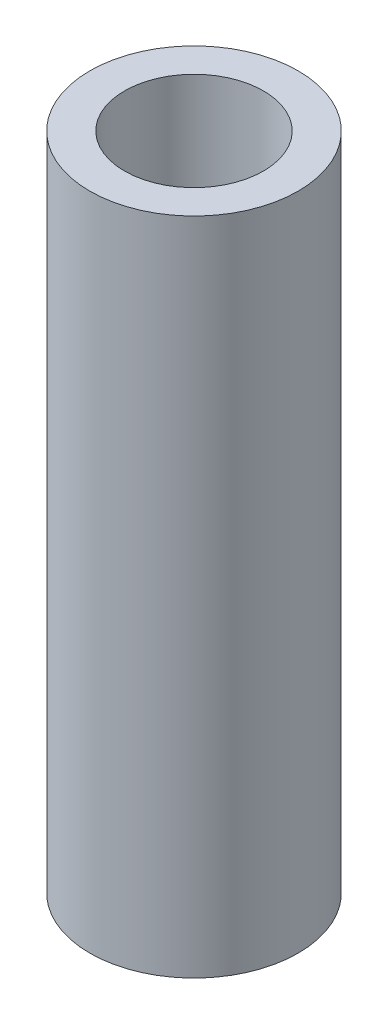
ISO-10303-21;
HEADER;
FILE_DESCRIPTION(('STEP AP214'),'2;1');
FILE_NAME('part.step','',(''),(''),'','','');
FILE_SCHEMA(('AUTOMOTIVE_DESIGN { 1 0 10303 214 1 1 1 1 }'));
ENDSEC;
DATA;
#1=APPLICATION_CONTEXT('core data for automotive mechanical design processes');
#2=APPLICATION_PROTOCOL_DEFINITION('international standard','automotive_design',2000,#1);
#3=PRODUCT_CONTEXT('',#1,'mechanical');
#4=PRODUCT('Part','Part','',(#3));
#5=PRODUCT_RELATED_PRODUCT_CATEGORY('part','',(#4));
#6=PRODUCT_DEFINITION_FORMATION('','',#4);
#7=PRODUCT_DEFINITION_CONTEXT('part definition',#1,'design');
#8=PRODUCT_DEFINITION('design','',#6,#7);
#9=PRODUCT_DEFINITION_SHAPE('','',#8);
#10=(LENGTH_UNIT() NAMED_UNIT(*) SI_UNIT(.MILLI.,.METRE.));
#11=(NAMED_UNIT(*) PLANE_ANGLE_UNIT() SI_UNIT($,.RADIAN.));
#12=(NAMED_UNIT(*) SI_UNIT($,.STERADIAN.) SOLID_ANGLE_UNIT());
#13=UNCERTAINTY_MEASURE_WITH_UNIT(LENGTH_MEASURE(1.E-05),#10,'distance_accuracy_value','');
#14=(GEOMETRIC_REPRESENTATION_CONTEXT(3) GLOBAL_UNCERTAINTY_ASSIGNED_CONTEXT((#13)) GLOBAL_UNIT_ASSIGNED_CONTEXT((#10,
#11,#12)) REPRESENTATION_CONTEXT('',''));
#15=CARTESIAN_POINT('',(0.,0.,0.));
#16=DIRECTION('',(0.,0.,1.));
#17=DIRECTION('',(1.,0.,0.));
#18=AXIS2_PLACEMENT_3D('',#15,#16,#17);
#19=CARTESIAN_POINT('',(0.,190.,0.));
#20=DIRECTION('',(0.,1.,0.));
#21=DIRECTION('',(0.,0.,1.));
#22=AXIS2_PLACEMENT_3D('',#19,#20,#21);
#23=PLANE('',#22);
#24=CARTESIAN_POINT('',(0.,190.,0.));
#25=DIRECTION('',(0.,1.,0.));
#26=DIRECTION('',(0.,0.,1.));
#27=AXIS2_PLACEMENT_3D('',#24,#25,#26);
#28=CIRCLE('',#27,30.);
#29=CARTESIAN_POINT('',(0.,190.,30.));
#30=VERTEX_POINT('',#29);
#31=EDGE_CURVE('E11',#30,#30,#28,.T.);
#32=ORIENTED_EDGE('',*,*,#31,.T.);
#33=EDGE_LOOP('',(#32));
#34=FACE_BOUND('',#33,.T.);
#35=CARTESIAN_POINT('',(0.,190.,0.));
#36=DIRECTION('',(0.,1.,0.));
#37=DIRECTION('',(0.,0.,1.));
#38=AXIS2_PLACEMENT_3D('',#35,#36,#37);
#39=CIRCLE('',#38,20.);
#40=CARTESIAN_POINT('',(0.,190.,20.));
#41=VERTEX_POINT('',#40);
#42=EDGE_CURVE('E56',#41,#41,#39,.T.);
#43=ORIENTED_EDGE('',*,*,#42,.F.);
#44=EDGE_LOOP('',(#43));
#45=FACE_BOUND('',#44,.T.);
#46=ADVANCED_FACE('F43',(#34,#45),#23,.T.);
#47=CARTESIAN_POINT('',(0.,0.,0.));
#48=DIRECTION('',(0.,1.,0.));
#49=DIRECTION('',(0.,0.,1.));
#50=AXIS2_PLACEMENT_3D('',#47,#48,#49);
#51=PLANE('',#50);
#52=CARTESIAN_POINT('',(0.,0.,0.));
#53=DIRECTION('',(0.,1.,0.));
#54=DIRECTION('',(0.,0.,1.));
#55=AXIS2_PLACEMENT_3D('',#52,#53,#54);
#56=CIRCLE('',#55,30.);
#57=CARTESIAN_POINT('',(0.,0.,30.));
#58=VERTEX_POINT('',#57);
#59=EDGE_CURVE('E47',#58,#58,#56,.T.);
#60=ORIENTED_EDGE('',*,*,#59,.F.);
#61=EDGE_LOOP('',(#60));
#62=FACE_BOUND('',#61,.T.);
#63=CARTESIAN_POINT('',(0.,0.,0.));
#64=DIRECTION('',(0.,1.,0.));
#65=DIRECTION('',(0.,0.,1.));
#66=AXIS2_PLACEMENT_3D('',#63,#64,#65);
#67=CIRCLE('',#66,20.);
#68=CARTESIAN_POINT('',(0.,0.,20.));
#69=VERTEX_POINT('',#68);
#70=EDGE_CURVE('E58',#69,#69,#67,.T.);
#71=ORIENTED_EDGE('',*,*,#70,.T.);
#72=EDGE_LOOP('',(#71));
#73=FACE_BOUND('',#72,.T.);
#74=ADVANCED_FACE('F70',(#62,#73),#51,.F.);
#75=CARTESIAN_POINT('',(0.,190.,0.));
#76=DIRECTION('',(0.,-1.,0.));
#77=DIRECTION('',(0.,0.,-1.));
#78=AXIS2_PLACEMENT_3D('',#75,#76,#77);
#79=CYLINDRICAL_SURFACE('',#78,30.);
#80=ORIENTED_EDGE('',*,*,#31,.F.);
#81=EDGE_LOOP('',(#80));
#82=FACE_BOUND('',#81,.T.);
#83=ORIENTED_EDGE('',*,*,#59,.T.);
#84=EDGE_LOOP('',(#83));
#85=FACE_BOUND('',#84,.T.);
#86=ADVANCED_FACE('F45',(#82,#85),#79,.T.);
#87=CARTESIAN_POINT('',(0.,190.,0.));
#88=DIRECTION('',(0.,-1.,0.));
#89=DIRECTION('',(0.,0.,-1.));
#90=AXIS2_PLACEMENT_3D('',#87,#88,#89);
#91=CYLINDRICAL_SURFACE('',#90,20.);
#92=ORIENTED_EDGE('',*,*,#42,.T.);
#93=EDGE_LOOP('',(#92));
#94=FACE_BOUND('',#93,.T.);
#95=ORIENTED_EDGE('',*,*,#70,.F.);
#96=EDGE_LOOP('',(#95));
#97=FACE_BOUND('',#96,.T.);
#98=ADVANCED_FACE('F66',(#94,#97),#91,.F.);
#99=CLOSED_SHELL('',(#46,#74,#86,#98));
#100=MANIFOLD_SOLID_BREP('B2',#99);
#101=ADVANCED_BREP_SHAPE_REPRESENTATION('',(#18,#100),#14);
#102=SHAPE_DEFINITION_REPRESENTATION(#9,#101);
ENDSEC;
END-ISO-10303-21;
